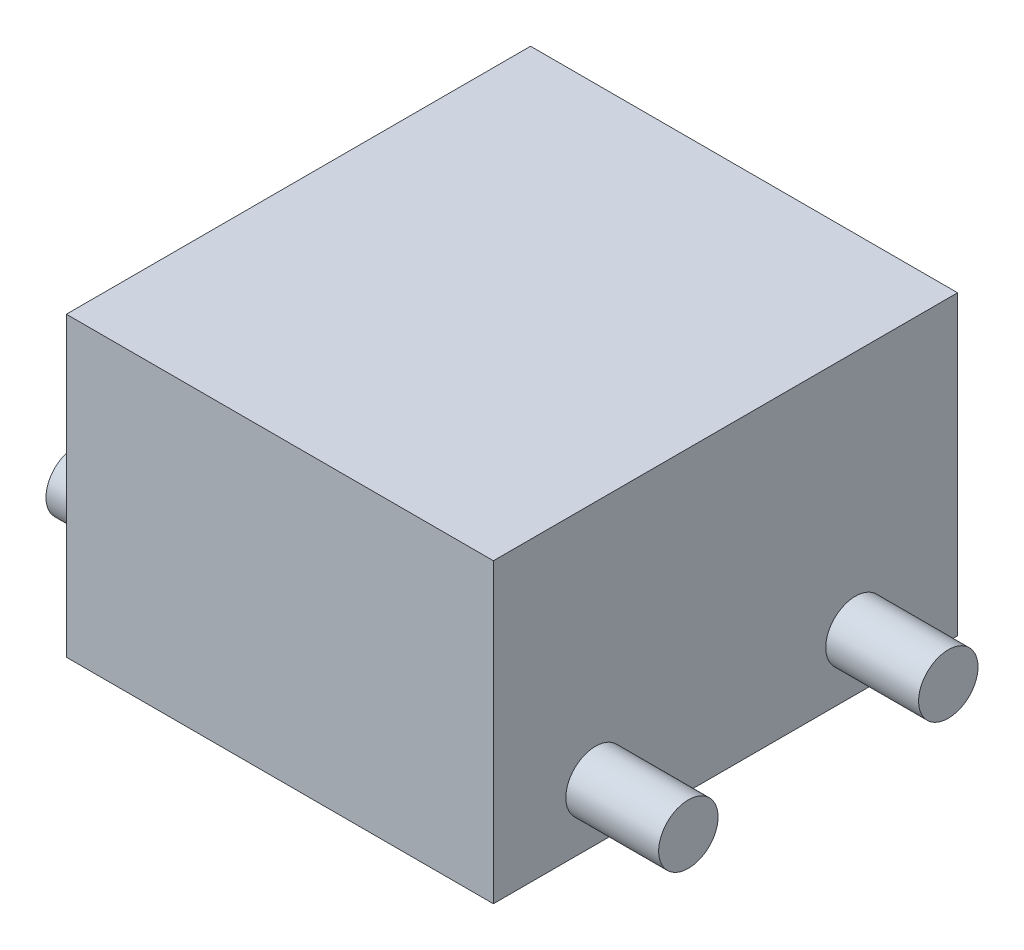
ISO-10303-21;
HEADER;
FILE_DESCRIPTION(('STEP AP214'),'2;1');
FILE_NAME('part.step','',(''),(''),'','','');
FILE_SCHEMA(('AUTOMOTIVE_DESIGN { 1 0 10303 214 1 1 1 1 }'));
ENDSEC;
DATA;
#1=APPLICATION_CONTEXT('core data for automotive mechanical design processes');
#2=APPLICATION_PROTOCOL_DEFINITION('international standard','automotive_design',2000,#1);
#3=PRODUCT_CONTEXT('',#1,'mechanical');
#4=PRODUCT('Part','Part','',(#3));
#5=PRODUCT_RELATED_PRODUCT_CATEGORY('part','',(#4));
#6=PRODUCT_DEFINITION_FORMATION('','',#4);
#7=PRODUCT_DEFINITION_CONTEXT('part definition',#1,'design');
#8=PRODUCT_DEFINITION('design','',#6,#7);
#9=PRODUCT_DEFINITION_SHAPE('','',#8);
#10=(LENGTH_UNIT() NAMED_UNIT(*) SI_UNIT(.MILLI.,.METRE.));
#11=(NAMED_UNIT(*) PLANE_ANGLE_UNIT() SI_UNIT($,.RADIAN.));
#12=(NAMED_UNIT(*) SI_UNIT($,.STERADIAN.) SOLID_ANGLE_UNIT());
#13=UNCERTAINTY_MEASURE_WITH_UNIT(LENGTH_MEASURE(1.E-05),#10,'distance_accuracy_value','');
#14=(GEOMETRIC_REPRESENTATION_CONTEXT(3) GLOBAL_UNCERTAINTY_ASSIGNED_CONTEXT((#13)) GLOBAL_UNIT_ASSIGNED_CONTEXT((#10,
#11,#12)) REPRESENTATION_CONTEXT('',''));
#15=CARTESIAN_POINT('',(0.,0.,0.));
#16=DIRECTION('',(0.,0.,1.));
#17=DIRECTION('',(1.,0.,0.));
#18=AXIS2_PLACEMENT_3D('',#15,#16,#17);
#19=CARTESIAN_POINT('',(0.,80.,0.));
#20=DIRECTION('',(0.,1.,0.));
#21=DIRECTION('',(0.,0.,1.));
#22=AXIS2_PLACEMENT_3D('',#19,#20,#21);
#23=PLANE('',#22);
#24=DIRECTION('',(1.,0.,0.));
#25=VECTOR('',#24,1.);
#26=CARTESIAN_POINT('',(-57.5,80.,62.5));
#27=LINE('',#26,#25);
#28=CARTESIAN_POINT('',(-57.5,80.,62.5));
#29=VERTEX_POINT('',#28);
#30=CARTESIAN_POINT('',(57.5,80.,62.5));
#31=VERTEX_POINT('',#30);
#32=EDGE_CURVE('E68',#29,#31,#27,.T.);
#33=ORIENTED_EDGE('',*,*,#32,.T.);
#34=DIRECTION('',(0.,0.,-1.));
#35=VECTOR('',#34,1.);
#36=CARTESIAN_POINT('',(57.5,80.,62.5));
#37=LINE('',#36,#35);
#38=CARTESIAN_POINT('',(57.5,80.,-62.5));
#39=VERTEX_POINT('',#38);
#40=EDGE_CURVE('E78',#31,#39,#37,.T.);
#41=ORIENTED_EDGE('',*,*,#40,.T.);
#42=DIRECTION('',(-1.,0.,0.));
#43=VECTOR('',#42,1.);
#44=CARTESIAN_POINT('',(-57.5,80.,-62.5));
#45=LINE('',#44,#43);
#46=CARTESIAN_POINT('',(-57.5,80.,-62.5));
#47=VERTEX_POINT('',#46);
#48=EDGE_CURVE('E94',#39,#47,#45,.T.);
#49=ORIENTED_EDGE('',*,*,#48,.T.);
#50=DIRECTION('',(0.,0.,1.));
#51=VECTOR('',#50,1.);
#52=CARTESIAN_POINT('',(-57.5,80.,62.5));
#53=LINE('',#52,#51);
#54=EDGE_CURVE('E74',#47,#29,#53,.T.);
#55=ORIENTED_EDGE('',*,*,#54,.T.);
#56=EDGE_LOOP('',(#33,#41,#49,#55));
#57=FACE_BOUND('',#56,.T.);
#58=ADVANCED_FACE('F36',(#57),#23,.T.);
#59=CARTESIAN_POINT('',(0.,0.,0.));
#60=DIRECTION('',(0.,1.,0.));
#61=DIRECTION('',(0.,0.,1.));
#62=AXIS2_PLACEMENT_3D('',#59,#60,#61);
#63=PLANE('',#62);
#64=DIRECTION('',(1.,0.,0.));
#65=VECTOR('',#64,1.);
#66=CARTESIAN_POINT('',(-57.5,0.,62.5));
#67=LINE('',#66,#65);
#68=CARTESIAN_POINT('',(-57.5,0.,62.5));
#69=VERTEX_POINT('',#68);
#70=CARTESIAN_POINT('',(57.5,0.,62.5));
#71=VERTEX_POINT('',#70);
#72=EDGE_CURVE('E134',#69,#71,#67,.T.);
#73=ORIENTED_EDGE('',*,*,#72,.F.);
#74=DIRECTION('',(0.,0.,1.));
#75=VECTOR('',#74,1.);
#76=CARTESIAN_POINT('',(-57.5,0.,62.5));
#77=LINE('',#76,#75);
#78=CARTESIAN_POINT('',(-57.5,0.,-62.5));
#79=VERTEX_POINT('',#78);
#80=EDGE_CURVE('E86',#79,#69,#77,.T.);
#81=ORIENTED_EDGE('',*,*,#80,.F.);
#82=DIRECTION('',(-1.,0.,0.));
#83=VECTOR('',#82,1.);
#84=CARTESIAN_POINT('',(-57.5,0.,-62.5));
#85=LINE('',#84,#83);
#86=CARTESIAN_POINT('',(57.5,0.,-62.5));
#87=VERTEX_POINT('',#86);
#88=EDGE_CURVE('E82',#87,#79,#85,.T.);
#89=ORIENTED_EDGE('',*,*,#88,.F.);
#90=DIRECTION('',(0.,0.,-1.));
#91=VECTOR('',#90,1.);
#92=CARTESIAN_POINT('',(57.5,0.,62.5));
#93=LINE('',#92,#91);
#94=EDGE_CURVE('E54',#71,#87,#93,.T.);
#95=ORIENTED_EDGE('',*,*,#94,.F.);
#96=EDGE_LOOP('',(#73,#81,#89,#95));
#97=FACE_BOUND('',#96,.T.);
#98=ADVANCED_FACE('F84',(#97),#63,.F.);
#99=CARTESIAN_POINT('',(-57.5,0.,62.5));
#100=DIRECTION('',(0.,0.,1.));
#101=DIRECTION('',(1.,0.,0.));
#102=AXIS2_PLACEMENT_3D('',#99,#100,#101);
#103=PLANE('',#102);
#104=ORIENTED_EDGE('',*,*,#32,.F.);
#105=DIRECTION('',(0.,1.,0.));
#106=VECTOR('',#105,1.);
#107=CARTESIAN_POINT('',(-57.5,0.,62.5));
#108=LINE('',#107,#106);
#109=EDGE_CURVE('E114',#69,#29,#108,.T.);
#110=ORIENTED_EDGE('',*,*,#109,.F.);
#111=ORIENTED_EDGE('',*,*,#72,.T.);
#112=DIRECTION('',(0.,1.,0.));
#113=VECTOR('',#112,1.);
#114=CARTESIAN_POINT('',(57.5,0.,62.5));
#115=LINE('',#114,#113);
#116=EDGE_CURVE('E98',#71,#31,#115,.T.);
#117=ORIENTED_EDGE('',*,*,#116,.T.);
#118=EDGE_LOOP('',(#104,#110,#111,#117));
#119=FACE_BOUND('',#118,.T.);
#120=ADVANCED_FACE('F192',(#119),#103,.T.);
#121=CARTESIAN_POINT('',(-57.5,0.,62.5));
#122=DIRECTION('',(-1.,0.,0.));
#123=DIRECTION('',(0.,0.,1.));
#124=AXIS2_PLACEMENT_3D('',#121,#122,#123);
#125=PLANE('',#124);
#126=CARTESIAN_POINT('',(-57.5,15.,-35.));
#127=DIRECTION('',(-1.,0.,0.));
#128=DIRECTION('',(0.,0.,1.));
#129=AXIS2_PLACEMENT_3D('',#126,#127,#128);
#130=CIRCLE('',#129,8.);
#131=CARTESIAN_POINT('',(-57.5,15.,-27.));
#132=VERTEX_POINT('',#131);
#133=EDGE_CURVE('E148',#132,#132,#130,.F.);
#134=ORIENTED_EDGE('',*,*,#133,.T.);
#135=EDGE_LOOP('',(#134));
#136=FACE_BOUND('',#135,.T.);
#137=CARTESIAN_POINT('',(-57.5,15.,35.));
#138=DIRECTION('',(-1.,0.,0.));
#139=DIRECTION('',(0.,0.,1.));
#140=AXIS2_PLACEMENT_3D('',#137,#138,#139);
#141=CIRCLE('',#140,8.);
#142=CARTESIAN_POINT('',(-57.5,15.,43.));
#143=VERTEX_POINT('',#142);
#144=EDGE_CURVE('E12',#143,#143,#141,.T.);
#145=ORIENTED_EDGE('',*,*,#144,.F.);
#146=EDGE_LOOP('',(#145));
#147=FACE_BOUND('',#146,.T.);
#148=ORIENTED_EDGE('',*,*,#54,.F.);
#149=DIRECTION('',(0.,1.,0.));
#150=VECTOR('',#149,1.);
#151=CARTESIAN_POINT('',(-57.5,0.,-62.5));
#152=LINE('',#151,#150);
#153=EDGE_CURVE('E123',#79,#47,#152,.T.);
#154=ORIENTED_EDGE('',*,*,#153,.F.);
#155=ORIENTED_EDGE('',*,*,#80,.T.);
#156=ORIENTED_EDGE('',*,*,#109,.T.);
#157=EDGE_LOOP('',(#148,#154,#155,#156));
#158=FACE_BOUND('',#157,.T.);
#159=ADVANCED_FACE('F186',(#136,#147,#158),#125,.T.);
#160=CARTESIAN_POINT('',(-57.5,0.,-62.5));
#161=DIRECTION('',(0.,0.,-1.));
#162=DIRECTION('',(-1.,0.,0.));
#163=AXIS2_PLACEMENT_3D('',#160,#161,#162);
#164=PLANE('',#163);
#165=ORIENTED_EDGE('',*,*,#48,.F.);
#166=DIRECTION('',(0.,1.,0.));
#167=VECTOR('',#166,1.);
#168=CARTESIAN_POINT('',(57.5,0.,-62.5));
#169=LINE('',#168,#167);
#170=EDGE_CURVE('E90',#87,#39,#169,.T.);
#171=ORIENTED_EDGE('',*,*,#170,.F.);
#172=ORIENTED_EDGE('',*,*,#88,.T.);
#173=ORIENTED_EDGE('',*,*,#153,.T.);
#174=EDGE_LOOP('',(#165,#171,#172,#173));
#175=FACE_BOUND('',#174,.T.);
#176=ADVANCED_FACE('F93',(#175),#164,.T.);
#177=CARTESIAN_POINT('',(57.5,0.,62.5));
#178=DIRECTION('',(1.,0.,0.));
#179=DIRECTION('',(0.,0.,-1.));
#180=AXIS2_PLACEMENT_3D('',#177,#178,#179);
#181=PLANE('',#180);
#182=CARTESIAN_POINT('',(57.5,15.,-35.));
#183=DIRECTION('',(1.,0.,0.));
#184=DIRECTION('',(0.,0.,-1.));
#185=AXIS2_PLACEMENT_3D('',#182,#183,#184);
#186=CIRCLE('',#185,8.);
#187=CARTESIAN_POINT('',(57.5,15.,-43.));
#188=VERTEX_POINT('',#187);
#189=EDGE_CURVE('E39',#188,#188,#186,.F.);
#190=ORIENTED_EDGE('',*,*,#189,.T.);
#191=EDGE_LOOP('',(#190));
#192=FACE_BOUND('',#191,.T.);
#193=CARTESIAN_POINT('',(57.5,15.,35.));
#194=DIRECTION('',(1.,0.,0.));
#195=DIRECTION('',(0.,0.,-1.));
#196=AXIS2_PLACEMENT_3D('',#193,#194,#195);
#197=CIRCLE('',#196,8.);
#198=CARTESIAN_POINT('',(57.5,15.,27.));
#199=VERTEX_POINT('',#198);
#200=EDGE_CURVE('E45',#199,#199,#197,.T.);
#201=ORIENTED_EDGE('',*,*,#200,.F.);
#202=EDGE_LOOP('',(#201));
#203=FACE_BOUND('',#202,.T.);
#204=ORIENTED_EDGE('',*,*,#40,.F.);
#205=ORIENTED_EDGE('',*,*,#116,.F.);
#206=ORIENTED_EDGE('',*,*,#94,.T.);
#207=ORIENTED_EDGE('',*,*,#170,.T.);
#208=EDGE_LOOP('',(#204,#205,#206,#207));
#209=FACE_BOUND('',#208,.T.);
#210=ADVANCED_FACE('F97',(#192,#203,#209),#181,.T.);
#211=CARTESIAN_POINT('',(82.5,15.,35.));
#212=DIRECTION('',(1.,0.,0.));
#213=DIRECTION('',(0.,0.,-1.));
#214=AXIS2_PLACEMENT_3D('',#211,#212,#213);
#215=PLANE('',#214);
#216=CARTESIAN_POINT('',(82.5,15.,35.));
#217=DIRECTION('',(1.,0.,0.));
#218=DIRECTION('',(0.,0.,-1.));
#219=AXIS2_PLACEMENT_3D('',#216,#217,#218);
#220=CIRCLE('',#219,8.);
#221=CARTESIAN_POINT('',(82.5,15.,27.));
#222=VERTEX_POINT('',#221);
#223=EDGE_CURVE('E145',#222,#222,#220,.T.);
#224=ORIENTED_EDGE('',*,*,#223,.T.);
#225=EDGE_LOOP('',(#224));
#226=FACE_BOUND('',#225,.T.);
#227=ADVANCED_FACE('F176',(#226),#215,.T.);
#228=CARTESIAN_POINT('',(-82.5,15.,35.));
#229=DIRECTION('',(1.,0.,0.));
#230=DIRECTION('',(0.,0.,-1.));
#231=AXIS2_PLACEMENT_3D('',#228,#229,#230);
#232=CYLINDRICAL_SURFACE('',#231,8.);
#233=ORIENTED_EDGE('',*,*,#200,.T.);
#234=EDGE_LOOP('',(#233));
#235=FACE_BOUND('',#234,.T.);
#236=ORIENTED_EDGE('',*,*,#223,.F.);
#237=EDGE_LOOP('',(#236));
#238=FACE_BOUND('',#237,.T.);
#239=ADVANCED_FACE('F183',(#235,#238),#232,.T.);
#240=ORIENTED_EDGE('',*,*,#144,.T.);
#241=EDGE_LOOP('',(#240));
#242=FACE_BOUND('',#241,.T.);
#243=CARTESIAN_POINT('',(-82.5,15.,35.));
#244=DIRECTION('',(1.,0.,0.));
#245=DIRECTION('',(0.,0.,-1.));
#246=AXIS2_PLACEMENT_3D('',#243,#244,#245);
#247=CIRCLE('',#246,8.);
#248=CARTESIAN_POINT('',(-82.5,15.,27.));
#249=VERTEX_POINT('',#248);
#250=EDGE_CURVE('E115',#249,#249,#247,.T.);
#251=ORIENTED_EDGE('',*,*,#250,.T.);
#252=EDGE_LOOP('',(#251));
#253=FACE_BOUND('',#252,.T.);
#254=ADVANCED_FACE('F171',(#242,#253),#232,.T.);
#255=CARTESIAN_POINT('',(-82.5,15.,35.));
#256=DIRECTION('',(1.,0.,0.));
#257=DIRECTION('',(0.,0.,-1.));
#258=AXIS2_PLACEMENT_3D('',#255,#256,#257);
#259=PLANE('',#258);
#260=ORIENTED_EDGE('',*,*,#250,.F.);
#261=EDGE_LOOP('',(#260));
#262=FACE_BOUND('',#261,.T.);
#263=ADVANCED_FACE('F162',(#262),#259,.F.);
#264=CARTESIAN_POINT('',(82.5,15.,-35.));
#265=DIRECTION('',(1.,0.,0.));
#266=DIRECTION('',(0.,0.,1.));
#267=AXIS2_PLACEMENT_3D('',#264,#265,#266);
#268=PLANE('',#267);
#269=CARTESIAN_POINT('',(82.5,15.,-35.));
#270=DIRECTION('',(-1.,0.,0.));
#271=DIRECTION('',(0.,0.,1.));
#272=AXIS2_PLACEMENT_3D('',#269,#270,#271);
#273=CIRCLE('',#272,8.);
#274=CARTESIAN_POINT('',(82.5,15.,-27.));
#275=VERTEX_POINT('',#274);
#276=EDGE_CURVE('E154',#275,#275,#273,.T.);
#277=ORIENTED_EDGE('',*,*,#276,.F.);
#278=EDGE_LOOP('',(#277));
#279=FACE_BOUND('',#278,.T.);
#280=ADVANCED_FACE('F160',(#279),#268,.T.);
#281=CARTESIAN_POINT('',(-82.5,15.,-35.));
#282=DIRECTION('',(1.,0.,0.));
#283=DIRECTION('',(0.,0.,-1.));
#284=AXIS2_PLACEMENT_3D('',#281,#282,#283);
#285=CYLINDRICAL_SURFACE('',#284,8.);
#286=ORIENTED_EDGE('',*,*,#189,.F.);
#287=EDGE_LOOP('',(#286));
#288=FACE_BOUND('',#287,.T.);
#289=ORIENTED_EDGE('',*,*,#276,.T.);
#290=EDGE_LOOP('',(#289));
#291=FACE_BOUND('',#290,.T.);
#292=ADVANCED_FACE('F158',(#288,#291),#285,.T.);
#293=ORIENTED_EDGE('',*,*,#133,.F.);
#294=EDGE_LOOP('',(#293));
#295=FACE_BOUND('',#294,.T.);
#296=CARTESIAN_POINT('',(-82.5,15.,-35.));
#297=DIRECTION('',(-1.,0.,0.));
#298=DIRECTION('',(0.,0.,1.));
#299=AXIS2_PLACEMENT_3D('',#296,#297,#298);
#300=CIRCLE('',#299,8.);
#301=CARTESIAN_POINT('',(-82.5,15.,-27.));
#302=VERTEX_POINT('',#301);
#303=EDGE_CURVE('E151',#302,#302,#300,.T.);
#304=ORIENTED_EDGE('',*,*,#303,.F.);
#305=EDGE_LOOP('',(#304));
#306=FACE_BOUND('',#305,.T.);
#307=ADVANCED_FACE('F168',(#295,#306),#285,.T.);
#308=CARTESIAN_POINT('',(-82.5,15.,-35.));
#309=DIRECTION('',(1.,0.,0.));
#310=DIRECTION('',(0.,0.,1.));
#311=AXIS2_PLACEMENT_3D('',#308,#309,#310);
#312=PLANE('',#311);
#313=ORIENTED_EDGE('',*,*,#303,.T.);
#314=EDGE_LOOP('',(#313));
#315=FACE_BOUND('',#314,.T.);
#316=ADVANCED_FACE('F276',(#315),#312,.F.);
#317=CLOSED_SHELL('',(#58,#98,#120,#159,#176,#210,#227,#239,#254,#263,#280,#292,#307,#316));
#318=MANIFOLD_SOLID_BREP('B2',#317);
#319=ADVANCED_BREP_SHAPE_REPRESENTATION('',(#18,#318),#14);
#320=SHAPE_DEFINITION_REPRESENTATION(#9,#319);
ENDSEC;
END-ISO-10303-21;
